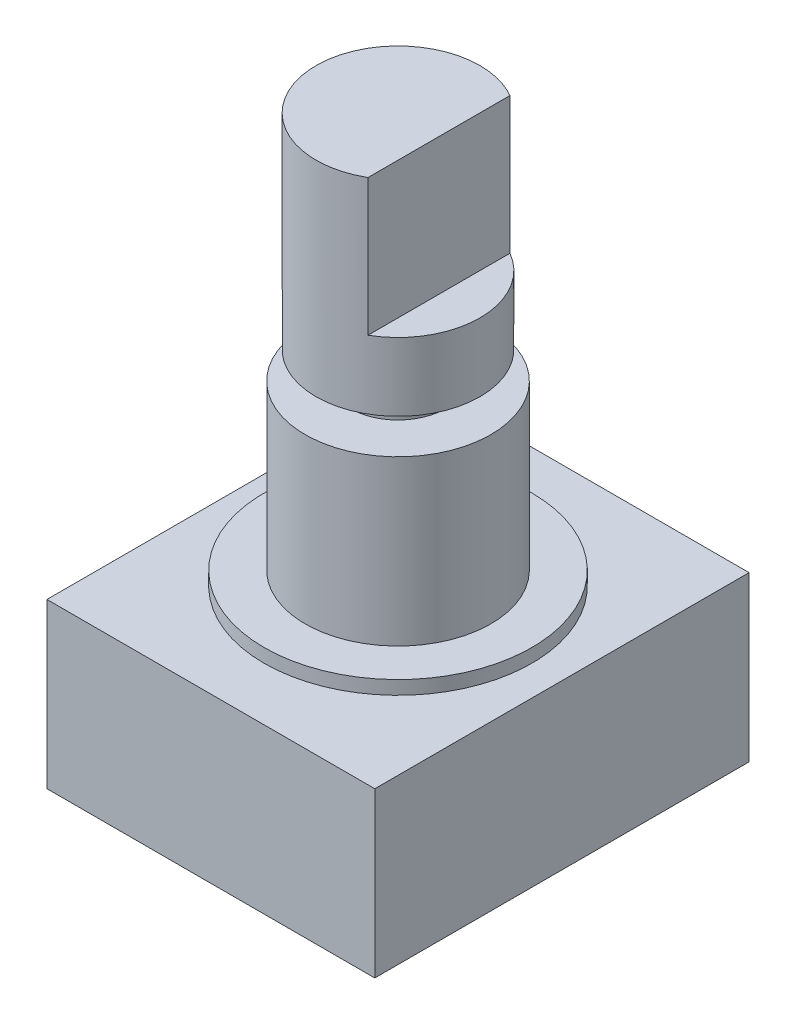
ISO-10303-21;
HEADER;
FILE_DESCRIPTION(('STEP AP214'),'2;1');
FILE_NAME('part.step','',(''),(''),'','','');
FILE_SCHEMA(('AUTOMOTIVE_DESIGN { 1 0 10303 214 1 1 1 1 }'));
ENDSEC;
DATA;
#1=APPLICATION_CONTEXT('core data for automotive mechanical design processes');
#2=APPLICATION_PROTOCOL_DEFINITION('international standard','automotive_design',2000,#1);
#3=PRODUCT_CONTEXT('',#1,'mechanical');
#4=PRODUCT('Part','Part','',(#3));
#5=PRODUCT_RELATED_PRODUCT_CATEGORY('part','',(#4));
#6=PRODUCT_DEFINITION_FORMATION('','',#4);
#7=PRODUCT_DEFINITION_CONTEXT('part definition',#1,'design');
#8=PRODUCT_DEFINITION('design','',#6,#7);
#9=PRODUCT_DEFINITION_SHAPE('','',#8);
#10=(LENGTH_UNIT() NAMED_UNIT(*) SI_UNIT(.MILLI.,.METRE.));
#11=(NAMED_UNIT(*) PLANE_ANGLE_UNIT() SI_UNIT($,.RADIAN.));
#12=(NAMED_UNIT(*) SI_UNIT($,.STERADIAN.) SOLID_ANGLE_UNIT());
#13=UNCERTAINTY_MEASURE_WITH_UNIT(LENGTH_MEASURE(1.E-05),#10,'distance_accuracy_value','');
#14=(GEOMETRIC_REPRESENTATION_CONTEXT(3) GLOBAL_UNCERTAINTY_ASSIGNED_CONTEXT((#13)) GLOBAL_UNIT_ASSIGNED_CONTEXT((#10,
#11,#12)) REPRESENTATION_CONTEXT('',''));
#15=CARTESIAN_POINT('',(0.,0.,0.));
#16=DIRECTION('',(0.,0.,1.));
#17=DIRECTION('',(1.,0.,0.));
#18=AXIS2_PLACEMENT_3D('',#15,#16,#17);
#19=CARTESIAN_POINT('',(0.,15.,0.));
#20=DIRECTION('',(0.,-1.,0.));
#21=DIRECTION('',(0.,0.,-1.));
#22=AXIS2_PLACEMENT_3D('',#19,#20,#21);
#23=PLANE('',#22);
#24=CARTESIAN_POINT('',(0.,15.,0.));
#25=DIRECTION('',(0.,-1.,0.));
#26=DIRECTION('',(0.,0.,-1.));
#27=AXIS2_PLACEMENT_3D('',#24,#25,#26);
#28=CIRCLE('',#27,3.);
#29=CARTESIAN_POINT('',(1.5,15.,2.59807621135332));
#30=VERTEX_POINT('',#29);
#31=CARTESIAN_POINT('',(1.5,15.,-2.59807621135332));
#32=VERTEX_POINT('',#31);
#33=EDGE_CURVE('E40',#30,#32,#28,.T.);
#34=ORIENTED_EDGE('',*,*,#33,.F.);
#35=DIRECTION('',(0.,0.,1.));
#36=VECTOR('',#35,1.);
#37=CARTESIAN_POINT('',(1.5,15.,2.59807621135332));
#38=LINE('',#37,#36);
#39=EDGE_CURVE('E60',#32,#30,#38,.T.);
#40=ORIENTED_EDGE('',*,*,#39,.F.);
#41=EDGE_LOOP('',(#34,#40));
#42=FACE_BOUND('',#41,.T.);
#43=ADVANCED_FACE('F33',(#42),#23,.F.);
#44=CARTESIAN_POINT('',(0.,0.,0.));
#45=DIRECTION('',(0.,-1.,0.));
#46=DIRECTION('',(0.,0.,-1.));
#47=AXIS2_PLACEMENT_3D('',#44,#45,#46);
#48=CYLINDRICAL_SURFACE('',#47,3.);
#49=ORIENTED_EDGE('',*,*,#33,.T.);
#50=DIRECTION('',(0.,1.,0.));
#51=VECTOR('',#50,1.);
#52=CARTESIAN_POINT('',(1.5,10.,-2.59807621135332));
#53=LINE('',#52,#51);
#54=CARTESIAN_POINT('',(1.5,10.,-2.59807621135332));
#55=VERTEX_POINT('',#54);
#56=EDGE_CURVE('E132',#55,#32,#53,.T.);
#57=ORIENTED_EDGE('',*,*,#56,.F.);
#58=CARTESIAN_POINT('',(0.,10.,0.));
#59=DIRECTION('',(0.,1.,0.));
#60=DIRECTION('',(0.,0.,1.));
#61=AXIS2_PLACEMENT_3D('',#58,#59,#60);
#62=CIRCLE('',#61,3.);
#63=CARTESIAN_POINT('',(1.5,10.,2.59807621135332));
#64=VERTEX_POINT('',#63);
#65=EDGE_CURVE('E11',#64,#55,#62,.T.);
#66=ORIENTED_EDGE('',*,*,#65,.F.);
#67=DIRECTION('',(0.,1.,0.));
#68=VECTOR('',#67,1.);
#69=CARTESIAN_POINT('',(1.5,10.,2.59807621135332));
#70=LINE('',#69,#68);
#71=EDGE_CURVE('E130',#64,#30,#70,.T.);
#72=ORIENTED_EDGE('',*,*,#71,.T.);
#73=EDGE_LOOP('',(#49,#57,#66,#72));
#74=FACE_BOUND('',#73,.T.);
#75=CARTESIAN_POINT('',(0.,7.5,0.));
#76=DIRECTION('',(0.,-1.,0.));
#77=DIRECTION('',(0.,0.,-1.));
#78=AXIS2_PLACEMENT_3D('',#75,#76,#77);
#79=CIRCLE('',#78,3.);
#80=CARTESIAN_POINT('',(0.,7.5,-3.));
#81=VERTEX_POINT('',#80);
#82=EDGE_CURVE('E153',#81,#81,#79,.T.);
#83=ORIENTED_EDGE('',*,*,#82,.F.);
#84=EDGE_LOOP('',(#83));
#85=FACE_BOUND('',#84,.T.);
#86=ADVANCED_FACE('F159',(#74,#85),#48,.T.);
#87=CARTESIAN_POINT('',(-3.,7.5,0.));
#88=DIRECTION('',(0.,1.,0.));
#89=DIRECTION('',(0.,0.,1.));
#90=AXIS2_PLACEMENT_3D('',#87,#88,#89);
#91=PLANE('',#90);
#92=CARTESIAN_POINT('',(0.,7.5,0.));
#93=DIRECTION('',(0.,-1.,0.));
#94=DIRECTION('',(0.,0.,-1.));
#95=AXIS2_PLACEMENT_3D('',#92,#93,#94);
#96=CIRCLE('',#95,1.75);
#97=CARTESIAN_POINT('',(0.,7.5,-1.75));
#98=VERTEX_POINT('',#97);
#99=EDGE_CURVE('E150',#98,#98,#96,.T.);
#100=ORIENTED_EDGE('',*,*,#99,.F.);
#101=EDGE_LOOP('',(#100));
#102=FACE_BOUND('',#101,.T.);
#103=ORIENTED_EDGE('',*,*,#82,.T.);
#104=EDGE_LOOP('',(#103));
#105=FACE_BOUND('',#104,.T.);
#106=ADVANCED_FACE('F166',(#102,#105),#91,.F.);
#107=CARTESIAN_POINT('',(0.,0.,0.));
#108=DIRECTION('',(0.,-1.,0.));
#109=DIRECTION('',(0.,0.,-1.));
#110=AXIS2_PLACEMENT_3D('',#107,#108,#109);
#111=CYLINDRICAL_SURFACE('',#110,1.75);
#112=CARTESIAN_POINT('',(0.,6.5,0.));
#113=DIRECTION('',(0.,-1.,0.));
#114=DIRECTION('',(0.,0.,-1.));
#115=AXIS2_PLACEMENT_3D('',#112,#113,#114);
#116=CIRCLE('',#115,1.75);
#117=CARTESIAN_POINT('',(0.,6.5,-1.75));
#118=VERTEX_POINT('',#117);
#119=EDGE_CURVE('E147',#118,#118,#116,.T.);
#120=ORIENTED_EDGE('',*,*,#119,.F.);
#121=EDGE_LOOP('',(#120));
#122=FACE_BOUND('',#121,.T.);
#123=ORIENTED_EDGE('',*,*,#99,.T.);
#124=EDGE_LOOP('',(#123));
#125=FACE_BOUND('',#124,.T.);
#126=ADVANCED_FACE('F170',(#122,#125),#111,.T.);
#127=CARTESIAN_POINT('',(-1.75,6.5,0.));
#128=DIRECTION('',(0.,-1.,0.));
#129=DIRECTION('',(0.,0.,-1.));
#130=AXIS2_PLACEMENT_3D('',#127,#128,#129);
#131=PLANE('',#130);
#132=CARTESIAN_POINT('',(0.,6.5,0.));
#133=DIRECTION('',(0.,-1.,0.));
#134=DIRECTION('',(0.,0.,-1.));
#135=AXIS2_PLACEMENT_3D('',#132,#133,#134);
#136=CIRCLE('',#135,3.4);
#137=CARTESIAN_POINT('',(0.,6.5,-3.4));
#138=VERTEX_POINT('',#137);
#139=EDGE_CURVE('E144',#138,#138,#136,.T.);
#140=ORIENTED_EDGE('',*,*,#139,.F.);
#141=EDGE_LOOP('',(#140));
#142=FACE_BOUND('',#141,.T.);
#143=ORIENTED_EDGE('',*,*,#119,.T.);
#144=EDGE_LOOP('',(#143));
#145=FACE_BOUND('',#144,.T.);
#146=ADVANCED_FACE('F176',(#142,#145),#131,.F.);
#147=CARTESIAN_POINT('',(0.,0.,0.));
#148=DIRECTION('',(0.,-1.,0.));
#149=DIRECTION('',(0.,0.,-1.));
#150=AXIS2_PLACEMENT_3D('',#147,#148,#149);
#151=CYLINDRICAL_SURFACE('',#150,3.4);
#152=CARTESIAN_POINT('',(0.,0.5,0.));
#153=DIRECTION('',(0.,-1.,0.));
#154=DIRECTION('',(0.,0.,-1.));
#155=AXIS2_PLACEMENT_3D('',#152,#153,#154);
#156=CIRCLE('',#155,3.4);
#157=CARTESIAN_POINT('',(0.,0.5,-3.4));
#158=VERTEX_POINT('',#157);
#159=EDGE_CURVE('E141',#158,#158,#156,.T.);
#160=ORIENTED_EDGE('',*,*,#159,.F.);
#161=EDGE_LOOP('',(#160));
#162=FACE_BOUND('',#161,.T.);
#163=ORIENTED_EDGE('',*,*,#139,.T.);
#164=EDGE_LOOP('',(#163));
#165=FACE_BOUND('',#164,.T.);
#166=ADVANCED_FACE('F180',(#162,#165),#151,.T.);
#167=CARTESIAN_POINT('',(-3.4,0.5,0.));
#168=DIRECTION('',(0.,-1.,0.));
#169=DIRECTION('',(0.,0.,-1.));
#170=AXIS2_PLACEMENT_3D('',#167,#168,#169);
#171=PLANE('',#170);
#172=CARTESIAN_POINT('',(0.,0.5,0.));
#173=DIRECTION('',(0.,-1.,0.));
#174=DIRECTION('',(0.,0.,-1.));
#175=AXIS2_PLACEMENT_3D('',#172,#173,#174);
#176=CIRCLE('',#175,4.9);
#177=CARTESIAN_POINT('',(0.,0.5,-4.9));
#178=VERTEX_POINT('',#177);
#179=EDGE_CURVE('E138',#178,#178,#176,.T.);
#180=ORIENTED_EDGE('',*,*,#179,.F.);
#181=EDGE_LOOP('',(#180));
#182=FACE_BOUND('',#181,.T.);
#183=ORIENTED_EDGE('',*,*,#159,.T.);
#184=EDGE_LOOP('',(#183));
#185=FACE_BOUND('',#184,.T.);
#186=ADVANCED_FACE('F184',(#182,#185),#171,.F.);
#187=CARTESIAN_POINT('',(0.,0.,0.));
#188=DIRECTION('',(0.,-1.,0.));
#189=DIRECTION('',(0.,0.,-1.));
#190=AXIS2_PLACEMENT_3D('',#187,#188,#189);
#191=CYLINDRICAL_SURFACE('',#190,4.9);
#192=CARTESIAN_POINT('',(0.,0.,0.));
#193=DIRECTION('',(0.,-1.,0.));
#194=DIRECTION('',(0.,0.,-1.));
#195=AXIS2_PLACEMENT_3D('',#192,#193,#194);
#196=CIRCLE('',#195,4.9);
#197=CARTESIAN_POINT('',(0.,0.,-4.9));
#198=VERTEX_POINT('',#197);
#199=EDGE_CURVE('E134',#198,#198,#196,.T.);
#200=ORIENTED_EDGE('',*,*,#199,.F.);
#201=EDGE_LOOP('',(#200));
#202=FACE_BOUND('',#201,.T.);
#203=ORIENTED_EDGE('',*,*,#179,.T.);
#204=EDGE_LOOP('',(#203));
#205=FACE_BOUND('',#204,.T.);
#206=ADVANCED_FACE('F188',(#202,#205),#191,.T.);
#207=CARTESIAN_POINT('',(0.,10.,0.));
#208=DIRECTION('',(0.,1.,0.));
#209=DIRECTION('',(0.,0.,1.));
#210=AXIS2_PLACEMENT_3D('',#207,#208,#209);
#211=PLANE('',#210);
#212=ORIENTED_EDGE('',*,*,#65,.T.);
#213=DIRECTION('',(0.,0.,1.));
#214=VECTOR('',#213,1.);
#215=CARTESIAN_POINT('',(1.5,10.,2.59807621135332));
#216=LINE('',#215,#214);
#217=EDGE_CURVE('E45',#55,#64,#216,.T.);
#218=ORIENTED_EDGE('',*,*,#217,.T.);
#219=EDGE_LOOP('',(#212,#218));
#220=FACE_BOUND('',#219,.T.);
#221=ADVANCED_FACE('F192',(#220),#211,.T.);
#222=CARTESIAN_POINT('',(1.5,10.,2.59807621135332));
#223=DIRECTION('',(-1.,0.,0.));
#224=DIRECTION('',(0.,0.,1.));
#225=AXIS2_PLACEMENT_3D('',#222,#223,#224);
#226=PLANE('',#225);
#227=ORIENTED_EDGE('',*,*,#39,.T.);
#228=ORIENTED_EDGE('',*,*,#71,.F.);
#229=ORIENTED_EDGE('',*,*,#217,.F.);
#230=ORIENTED_EDGE('',*,*,#56,.T.);
#231=EDGE_LOOP('',(#227,#228,#229,#230));
#232=FACE_BOUND('',#231,.T.);
#233=ADVANCED_FACE('F194',(#232),#226,.F.);
#234=CARTESIAN_POINT('',(6.,-6.,-6.85));
#235=DIRECTION('',(-1.,0.,0.));
#236=DIRECTION('',(0.,0.,1.));
#237=AXIS2_PLACEMENT_3D('',#234,#235,#236);
#238=PLANE('',#237);
#239=DIRECTION('',(0.,0.,1.));
#240=VECTOR('',#239,1.);
#241=CARTESIAN_POINT('',(6.,0.,-6.85));
#242=LINE('',#241,#240);
#243=CARTESIAN_POINT('',(6.,0.,-6.85));
#244=VERTEX_POINT('',#243);
#245=CARTESIAN_POINT('',(6.,0.,6.85));
#246=VERTEX_POINT('',#245);
#247=EDGE_CURVE('E120',#244,#246,#242,.T.);
#248=ORIENTED_EDGE('',*,*,#247,.T.);
#249=DIRECTION('',(0.,1.,0.));
#250=VECTOR('',#249,1.);
#251=CARTESIAN_POINT('',(6.,-6.,6.85));
#252=LINE('',#251,#250);
#253=CARTESIAN_POINT('',(6.,-6.,6.85));
#254=VERTEX_POINT('',#253);
#255=EDGE_CURVE('E111',#254,#246,#252,.T.);
#256=ORIENTED_EDGE('',*,*,#255,.F.);
#257=DIRECTION('',(0.,0.,1.));
#258=VECTOR('',#257,1.);
#259=CARTESIAN_POINT('',(6.,-6.,-6.85));
#260=LINE('',#259,#258);
#261=CARTESIAN_POINT('',(6.,-6.,-6.85));
#262=VERTEX_POINT('',#261);
#263=EDGE_CURVE('E105',#262,#254,#260,.T.);
#264=ORIENTED_EDGE('',*,*,#263,.F.);
#265=DIRECTION('',(0.,1.,0.));
#266=VECTOR('',#265,1.);
#267=CARTESIAN_POINT('',(6.,-6.,-6.85));
#268=LINE('',#267,#266);
#269=EDGE_CURVE('E116',#262,#244,#268,.T.);
#270=ORIENTED_EDGE('',*,*,#269,.T.);
#271=EDGE_LOOP('',(#248,#256,#264,#270));
#272=FACE_BOUND('',#271,.T.);
#273=ADVANCED_FACE('F197',(#272),#238,.F.);
#274=CARTESIAN_POINT('',(-6.,-6.,6.85));
#275=DIRECTION('',(0.,0.,-1.));
#276=DIRECTION('',(-1.,0.,0.));
#277=AXIS2_PLACEMENT_3D('',#274,#275,#276);
#278=PLANE('',#277);
#279=DIRECTION('',(-1.,0.,0.));
#280=VECTOR('',#279,1.);
#281=CARTESIAN_POINT('',(-6.,0.,6.85));
#282=LINE('',#281,#280);
#283=CARTESIAN_POINT('',(-6.,0.,6.85));
#284=VERTEX_POINT('',#283);
#285=EDGE_CURVE('E110',#246,#284,#282,.T.);
#286=ORIENTED_EDGE('',*,*,#285,.T.);
#287=DIRECTION('',(0.,1.,0.));
#288=VECTOR('',#287,1.);
#289=CARTESIAN_POINT('',(-6.,-6.,6.85));
#290=LINE('',#289,#288);
#291=CARTESIAN_POINT('',(-6.,-6.,6.85));
#292=VERTEX_POINT('',#291);
#293=EDGE_CURVE('E108',#292,#284,#290,.T.);
#294=ORIENTED_EDGE('',*,*,#293,.F.);
#295=DIRECTION('',(-1.,0.,0.));
#296=VECTOR('',#295,1.);
#297=CARTESIAN_POINT('',(-6.,-6.,6.85));
#298=LINE('',#297,#296);
#299=EDGE_CURVE('E100',#254,#292,#298,.T.);
#300=ORIENTED_EDGE('',*,*,#299,.F.);
#301=ORIENTED_EDGE('',*,*,#255,.T.);
#302=EDGE_LOOP('',(#286,#294,#300,#301));
#303=FACE_BOUND('',#302,.T.);
#304=ADVANCED_FACE('F109',(#303),#278,.F.);
#305=CARTESIAN_POINT('',(-6.,-6.,-6.85));
#306=DIRECTION('',(1.,0.,0.));
#307=DIRECTION('',(0.,0.,-1.));
#308=AXIS2_PLACEMENT_3D('',#305,#306,#307);
#309=PLANE('',#308);
#310=DIRECTION('',(0.,0.,-1.));
#311=VECTOR('',#310,1.);
#312=CARTESIAN_POINT('',(-6.,0.,-6.85));
#313=LINE('',#312,#311);
#314=CARTESIAN_POINT('',(-6.,0.,-6.85));
#315=VERTEX_POINT('',#314);
#316=EDGE_CURVE('E86',#284,#315,#313,.T.);
#317=ORIENTED_EDGE('',*,*,#316,.T.);
#318=DIRECTION('',(0.,1.,0.));
#319=VECTOR('',#318,1.);
#320=CARTESIAN_POINT('',(-6.,-6.,-6.85));
#321=LINE('',#320,#319);
#322=CARTESIAN_POINT('',(-6.,-6.,-6.85));
#323=VERTEX_POINT('',#322);
#324=EDGE_CURVE('E112',#323,#315,#321,.T.);
#325=ORIENTED_EDGE('',*,*,#324,.F.);
#326=DIRECTION('',(0.,0.,-1.));
#327=VECTOR('',#326,1.);
#328=CARTESIAN_POINT('',(-6.,-6.,-6.85));
#329=LINE('',#328,#327);
#330=EDGE_CURVE('E103',#292,#323,#329,.T.);
#331=ORIENTED_EDGE('',*,*,#330,.F.);
#332=ORIENTED_EDGE('',*,*,#293,.T.);
#333=EDGE_LOOP('',(#317,#325,#331,#332));
#334=FACE_BOUND('',#333,.T.);
#335=ADVANCED_FACE('F114',(#334),#309,.F.);
#336=CARTESIAN_POINT('',(-6.,-6.,-6.85));
#337=DIRECTION('',(0.,0.,1.));
#338=DIRECTION('',(1.,0.,0.));
#339=AXIS2_PLACEMENT_3D('',#336,#337,#338);
#340=PLANE('',#339);
#341=DIRECTION('',(1.,0.,0.));
#342=VECTOR('',#341,1.);
#343=CARTESIAN_POINT('',(-6.,0.,-6.85));
#344=LINE('',#343,#342);
#345=EDGE_CURVE('E92',#315,#244,#344,.T.);
#346=ORIENTED_EDGE('',*,*,#345,.T.);
#347=ORIENTED_EDGE('',*,*,#269,.F.);
#348=DIRECTION('',(1.,0.,0.));
#349=VECTOR('',#348,1.);
#350=CARTESIAN_POINT('',(-6.,-6.,-6.85));
#351=LINE('',#350,#349);
#352=EDGE_CURVE('E69',#323,#262,#351,.T.);
#353=ORIENTED_EDGE('',*,*,#352,.F.);
#354=ORIENTED_EDGE('',*,*,#324,.T.);
#355=EDGE_LOOP('',(#346,#347,#353,#354));
#356=FACE_BOUND('',#355,.T.);
#357=ADVANCED_FACE('F207',(#356),#340,.F.);
#358=CARTESIAN_POINT('',(0.,-6.,0.));
#359=DIRECTION('',(0.,1.,0.));
#360=DIRECTION('',(0.,0.,1.));
#361=AXIS2_PLACEMENT_3D('',#358,#359,#360);
#362=PLANE('',#361);
#363=ORIENTED_EDGE('',*,*,#263,.T.);
#364=ORIENTED_EDGE('',*,*,#299,.T.);
#365=ORIENTED_EDGE('',*,*,#330,.T.);
#366=ORIENTED_EDGE('',*,*,#352,.T.);
#367=EDGE_LOOP('',(#363,#364,#365,#366));
#368=FACE_BOUND('',#367,.T.);
#369=ADVANCED_FACE('F101',(#368),#362,.F.);
#370=CARTESIAN_POINT('',(0.,0.,0.));
#371=DIRECTION('',(0.,1.,0.));
#372=DIRECTION('',(0.,0.,1.));
#373=AXIS2_PLACEMENT_3D('',#370,#371,#372);
#374=PLANE('',#373);
#375=ORIENTED_EDGE('',*,*,#199,.T.);
#376=EDGE_LOOP('',(#375));
#377=FACE_BOUND('',#376,.T.);
#378=ORIENTED_EDGE('',*,*,#247,.F.);
#379=ORIENTED_EDGE('',*,*,#345,.F.);
#380=ORIENTED_EDGE('',*,*,#316,.F.);
#381=ORIENTED_EDGE('',*,*,#285,.F.);
#382=EDGE_LOOP('',(#378,#379,#380,#381));
#383=FACE_BOUND('',#382,.T.);
#384=ADVANCED_FACE('F210',(#377,#383),#374,.T.);
#385=CLOSED_SHELL('',(#43,#86,#106,#126,#146,#166,#186,#206,#221,#233,#273,#304,#335,#357,#369,#384));
#386=MANIFOLD_SOLID_BREP('B2',#385);
#387=ADVANCED_BREP_SHAPE_REPRESENTATION('',(#18,#386),#14);
#388=SHAPE_DEFINITION_REPRESENTATION(#9,#387);
ENDSEC;
END-ISO-10303-21;
